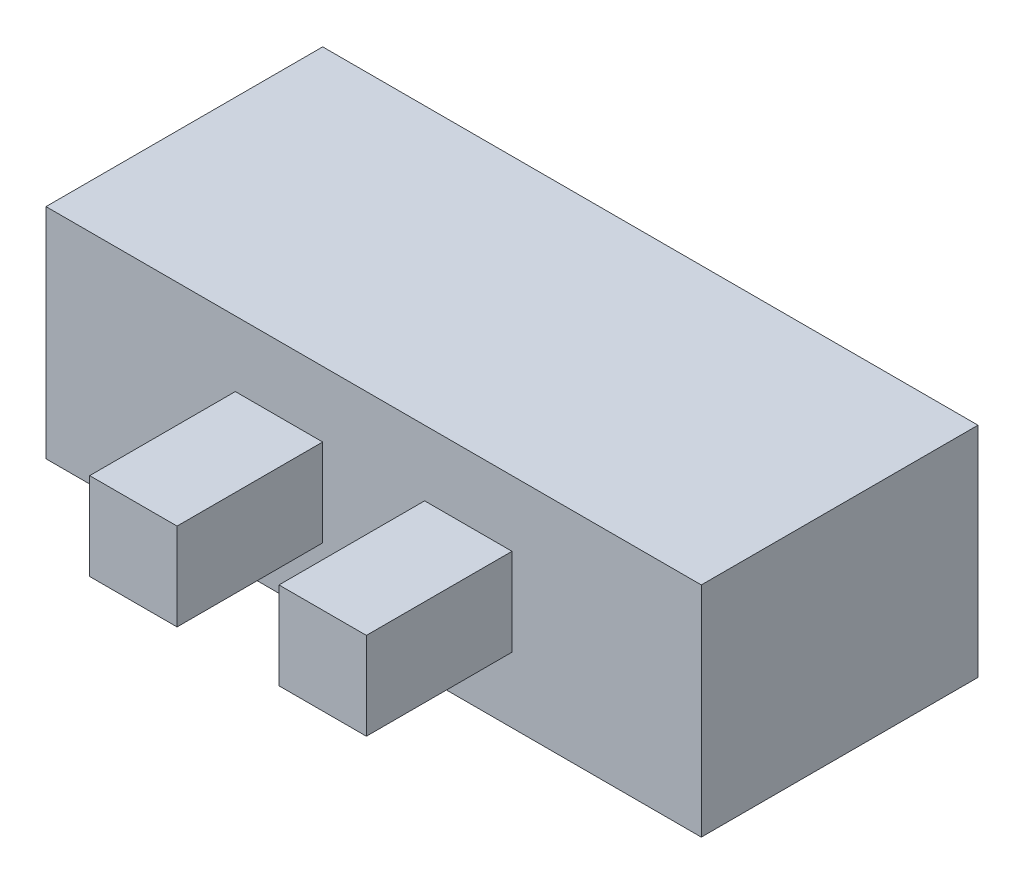
ISO-10303-21;
HEADER;
FILE_DESCRIPTION(('STEP AP214'),'2;1');
FILE_NAME('part.step','',(''),(''),'','','');
FILE_SCHEMA(('AUTOMOTIVE_DESIGN { 1 0 10303 214 1 1 1 1 }'));
ENDSEC;
DATA;
#1=APPLICATION_CONTEXT('core data for automotive mechanical design processes');
#2=APPLICATION_PROTOCOL_DEFINITION('international standard','automotive_design',2000,#1);
#3=PRODUCT_CONTEXT('',#1,'mechanical');
#4=PRODUCT('Part','Part','',(#3));
#5=PRODUCT_RELATED_PRODUCT_CATEGORY('part','',(#4));
#6=PRODUCT_DEFINITION_FORMATION('','',#4);
#7=PRODUCT_DEFINITION_CONTEXT('part definition',#1,'design');
#8=PRODUCT_DEFINITION('design','',#6,#7);
#9=PRODUCT_DEFINITION_SHAPE('','',#8);
#10=(LENGTH_UNIT() NAMED_UNIT(*) SI_UNIT(.MILLI.,.METRE.));
#11=(NAMED_UNIT(*) PLANE_ANGLE_UNIT() SI_UNIT($,.RADIAN.));
#12=(NAMED_UNIT(*) SI_UNIT($,.STERADIAN.) SOLID_ANGLE_UNIT());
#13=UNCERTAINTY_MEASURE_WITH_UNIT(LENGTH_MEASURE(1.E-05),#10,'distance_accuracy_value','');
#14=(GEOMETRIC_REPRESENTATION_CONTEXT(3) GLOBAL_UNCERTAINTY_ASSIGNED_CONTEXT((#13)) GLOBAL_UNIT_ASSIGNED_CONTEXT((#10,
#11,#12)) REPRESENTATION_CONTEXT('',''));
#15=CARTESIAN_POINT('',(0.,0.,0.));
#16=DIRECTION('',(0.,0.,1.));
#17=DIRECTION('',(1.,0.,0.));
#18=AXIS2_PLACEMENT_3D('',#15,#16,#17);
#19=CARTESIAN_POINT('',(0.,0.,3.8));
#20=DIRECTION('',(0.,0.,1.));
#21=DIRECTION('',(1.,0.,0.));
#22=AXIS2_PLACEMENT_3D('',#19,#20,#21);
#23=PLANE('',#22);
#24=DIRECTION('',(0.,-1.,0.));
#25=VECTOR('',#24,1.);
#26=CARTESIAN_POINT('',(0.,0.,3.8));
#27=LINE('',#26,#25);
#28=CARTESIAN_POINT('',(0.,0.,3.8));
#29=VERTEX_POINT('',#28);
#30=CARTESIAN_POINT('',(0.,-3.,3.8));
#31=VERTEX_POINT('',#30);
#32=EDGE_CURVE('E181',#29,#31,#27,.T.);
#33=ORIENTED_EDGE('',*,*,#32,.T.);
#34=DIRECTION('',(1.,0.,0.));
#35=VECTOR('',#34,1.);
#36=CARTESIAN_POINT('',(0.,-3.,3.8));
#37=LINE('',#36,#35);
#38=CARTESIAN_POINT('',(9.,-3.,3.8));
#39=VERTEX_POINT('',#38);
#40=EDGE_CURVE('E184',#31,#39,#37,.T.);
#41=ORIENTED_EDGE('',*,*,#40,.T.);
#42=DIRECTION('',(0.,1.,0.));
#43=VECTOR('',#42,1.);
#44=CARTESIAN_POINT('',(9.,0.,3.8));
#45=LINE('',#44,#43);
#46=CARTESIAN_POINT('',(9.,0.,3.8));
#47=VERTEX_POINT('',#46);
#48=EDGE_CURVE('E187',#39,#47,#45,.T.);
#49=ORIENTED_EDGE('',*,*,#48,.T.);
#50=DIRECTION('',(-1.,0.,0.));
#51=VECTOR('',#50,1.);
#52=CARTESIAN_POINT('',(0.,0.,3.8));
#53=LINE('',#52,#51);
#54=EDGE_CURVE('E189',#47,#29,#53,.T.);
#55=ORIENTED_EDGE('',*,*,#54,.T.);
#56=EDGE_LOOP('',(#33,#41,#49,#55));
#57=FACE_BOUND('',#56,.T.);
#58=DIRECTION('',(1.,0.,0.));
#59=VECTOR('',#58,1.);
#60=CARTESIAN_POINT('',(2.6,-2.1,3.8));
#61=LINE('',#60,#59);
#62=CARTESIAN_POINT('',(2.6,-2.1,3.8));
#63=VERTEX_POINT('',#62);
#64=CARTESIAN_POINT('',(3.8,-2.1,3.8));
#65=VERTEX_POINT('',#64);
#66=EDGE_CURVE('E152',#63,#65,#61,.T.);
#67=ORIENTED_EDGE('',*,*,#66,.F.);
#68=DIRECTION('',(0.,-1.,0.));
#69=VECTOR('',#68,1.);
#70=CARTESIAN_POINT('',(2.6,-2.1,3.8));
#71=LINE('',#70,#69);
#72=CARTESIAN_POINT('',(2.6,-0.9,3.8));
#73=VERTEX_POINT('',#72);
#74=EDGE_CURVE('E149',#73,#63,#71,.T.);
#75=ORIENTED_EDGE('',*,*,#74,.F.);
#76=DIRECTION('',(-1.,0.,0.));
#77=VECTOR('',#76,1.);
#78=CARTESIAN_POINT('',(2.6,-0.9,3.8));
#79=LINE('',#78,#77);
#80=CARTESIAN_POINT('',(3.8,-0.9,3.8));
#81=VERTEX_POINT('',#80);
#82=EDGE_CURVE('E161',#81,#73,#79,.T.);
#83=ORIENTED_EDGE('',*,*,#82,.F.);
#84=DIRECTION('',(0.,1.,0.));
#85=VECTOR('',#84,1.);
#86=CARTESIAN_POINT('',(3.8,-2.1,3.8));
#87=LINE('',#86,#85);
#88=EDGE_CURVE('E169',#65,#81,#87,.T.);
#89=ORIENTED_EDGE('',*,*,#88,.F.);
#90=EDGE_LOOP('',(#67,#75,#83,#89));
#91=FACE_BOUND('',#90,.T.);
#92=DIRECTION('',(1.,0.,0.));
#93=VECTOR('',#92,1.);
#94=CARTESIAN_POINT('',(5.2,-2.1,3.8));
#95=LINE('',#94,#93);
#96=CARTESIAN_POINT('',(5.2,-2.1,3.8));
#97=VERTEX_POINT('',#96);
#98=CARTESIAN_POINT('',(6.4,-2.1,3.8));
#99=VERTEX_POINT('',#98);
#100=EDGE_CURVE('E372',#97,#99,#95,.T.);
#101=ORIENTED_EDGE('',*,*,#100,.F.);
#102=DIRECTION('',(0.,-1.,0.));
#103=VECTOR('',#102,1.);
#104=CARTESIAN_POINT('',(5.2,-2.1,3.8));
#105=LINE('',#104,#103);
#106=CARTESIAN_POINT('',(5.2,-0.9,3.8));
#107=VERTEX_POINT('',#106);
#108=EDGE_CURVE('E147',#107,#97,#105,.T.);
#109=ORIENTED_EDGE('',*,*,#108,.F.);
#110=DIRECTION('',(-1.,0.,0.));
#111=VECTOR('',#110,1.);
#112=CARTESIAN_POINT('',(5.2,-0.9,3.8));
#113=LINE('',#112,#111);
#114=CARTESIAN_POINT('',(6.4,-0.9,3.8));
#115=VERTEX_POINT('',#114);
#116=EDGE_CURVE('E143',#115,#107,#113,.T.);
#117=ORIENTED_EDGE('',*,*,#116,.F.);
#118=DIRECTION('',(0.,1.,0.));
#119=VECTOR('',#118,1.);
#120=CARTESIAN_POINT('',(6.4,-2.1,3.8));
#121=LINE('',#120,#119);
#122=EDGE_CURVE('E369',#99,#115,#121,.T.);
#123=ORIENTED_EDGE('',*,*,#122,.F.);
#124=EDGE_LOOP('',(#101,#109,#117,#123));
#125=FACE_BOUND('',#124,.T.);
#126=ADVANCED_FACE('F34',(#57,#91,#125),#23,.T.);
#127=CARTESIAN_POINT('',(0.,0.,3.8));
#128=DIRECTION('',(1.,0.,0.));
#129=DIRECTION('',(0.,1.,0.));
#130=AXIS2_PLACEMENT_3D('',#127,#128,#129);
#131=PLANE('',#130);
#132=DIRECTION('',(0.,-1.,0.));
#133=VECTOR('',#132,1.);
#134=CARTESIAN_POINT('',(0.,0.,0.));
#135=LINE('',#134,#133);
#136=CARTESIAN_POINT('',(0.,0.,0.));
#137=VERTEX_POINT('',#136);
#138=CARTESIAN_POINT('',(0.,-3.,0.));
#139=VERTEX_POINT('',#138);
#140=EDGE_CURVE('E180',#137,#139,#135,.T.);
#141=ORIENTED_EDGE('',*,*,#140,.T.);
#142=DIRECTION('',(0.,0.,-1.));
#143=VECTOR('',#142,1.);
#144=CARTESIAN_POINT('',(0.,-3.,3.8));
#145=LINE('',#144,#143);
#146=EDGE_CURVE('E11',#31,#139,#145,.T.);
#147=ORIENTED_EDGE('',*,*,#146,.F.);
#148=ORIENTED_EDGE('',*,*,#32,.F.);
#149=DIRECTION('',(0.,0.,-1.));
#150=VECTOR('',#149,1.);
#151=CARTESIAN_POINT('',(0.,0.,3.8));
#152=LINE('',#151,#150);
#153=EDGE_CURVE('E191',#29,#137,#152,.T.);
#154=ORIENTED_EDGE('',*,*,#153,.T.);
#155=EDGE_LOOP('',(#141,#147,#148,#154));
#156=FACE_BOUND('',#155,.T.);
#157=ADVANCED_FACE('F36',(#156),#131,.F.);
#158=CARTESIAN_POINT('',(0.,-3.,3.8));
#159=DIRECTION('',(0.,1.,0.));
#160=DIRECTION('',(0.,0.,1.));
#161=AXIS2_PLACEMENT_3D('',#158,#159,#160);
#162=PLANE('',#161);
#163=DIRECTION('',(1.,0.,0.));
#164=VECTOR('',#163,1.);
#165=CARTESIAN_POINT('',(0.,-3.,0.));
#166=LINE('',#165,#164);
#167=CARTESIAN_POINT('',(9.,-3.,0.));
#168=VERTEX_POINT('',#167);
#169=EDGE_CURVE('E194',#139,#168,#166,.T.);
#170=ORIENTED_EDGE('',*,*,#169,.T.);
#171=DIRECTION('',(0.,0.,-1.));
#172=VECTOR('',#171,1.);
#173=CARTESIAN_POINT('',(9.,-3.,3.8));
#174=LINE('',#173,#172);
#175=EDGE_CURVE('E42',#39,#168,#174,.T.);
#176=ORIENTED_EDGE('',*,*,#175,.F.);
#177=ORIENTED_EDGE('',*,*,#40,.F.);
#178=ORIENTED_EDGE('',*,*,#146,.T.);
#179=EDGE_LOOP('',(#170,#176,#177,#178));
#180=FACE_BOUND('',#179,.T.);
#181=ADVANCED_FACE('F224',(#180),#162,.F.);
#182=CARTESIAN_POINT('',(9.,0.,3.8));
#183=DIRECTION('',(-1.,0.,0.));
#184=DIRECTION('',(0.,-1.,0.));
#185=AXIS2_PLACEMENT_3D('',#182,#183,#184);
#186=PLANE('',#185);
#187=DIRECTION('',(0.,1.,0.));
#188=VECTOR('',#187,1.);
#189=CARTESIAN_POINT('',(9.,0.,0.));
#190=LINE('',#189,#188);
#191=CARTESIAN_POINT('',(9.,0.,0.));
#192=VERTEX_POINT('',#191);
#193=EDGE_CURVE('E196',#168,#192,#190,.T.);
#194=ORIENTED_EDGE('',*,*,#193,.T.);
#195=DIRECTION('',(0.,0.,-1.));
#196=VECTOR('',#195,1.);
#197=CARTESIAN_POINT('',(9.,0.,3.8));
#198=LINE('',#197,#196);
#199=EDGE_CURVE('E201',#47,#192,#198,.T.);
#200=ORIENTED_EDGE('',*,*,#199,.F.);
#201=ORIENTED_EDGE('',*,*,#48,.F.);
#202=ORIENTED_EDGE('',*,*,#175,.T.);
#203=EDGE_LOOP('',(#194,#200,#201,#202));
#204=FACE_BOUND('',#203,.T.);
#205=ADVANCED_FACE('F208',(#204),#186,.F.);
#206=CARTESIAN_POINT('',(0.,0.,3.8));
#207=DIRECTION('',(0.,-1.,0.));
#208=DIRECTION('',(0.,0.,-1.));
#209=AXIS2_PLACEMENT_3D('',#206,#207,#208);
#210=PLANE('',#209);
#211=DIRECTION('',(-1.,0.,0.));
#212=VECTOR('',#211,1.);
#213=CARTESIAN_POINT('',(0.,0.,0.));
#214=LINE('',#213,#212);
#215=EDGE_CURVE('E185',#192,#137,#214,.T.);
#216=ORIENTED_EDGE('',*,*,#215,.T.);
#217=ORIENTED_EDGE('',*,*,#153,.F.);
#218=ORIENTED_EDGE('',*,*,#54,.F.);
#219=ORIENTED_EDGE('',*,*,#199,.T.);
#220=EDGE_LOOP('',(#216,#217,#218,#219));
#221=FACE_BOUND('',#220,.T.);
#222=ADVANCED_FACE('F217',(#221),#210,.F.);
#223=CARTESIAN_POINT('',(0.,0.,0.));
#224=DIRECTION('',(0.,0.,1.));
#225=DIRECTION('',(1.,0.,0.));
#226=AXIS2_PLACEMENT_3D('',#223,#224,#225);
#227=PLANE('',#226);
#228=ORIENTED_EDGE('',*,*,#140,.F.);
#229=ORIENTED_EDGE('',*,*,#215,.F.);
#230=ORIENTED_EDGE('',*,*,#193,.F.);
#231=ORIENTED_EDGE('',*,*,#169,.F.);
#232=EDGE_LOOP('',(#228,#229,#230,#231));
#233=FACE_BOUND('',#232,.T.);
#234=ADVANCED_FACE('F214',(#233),#227,.F.);
#235=CARTESIAN_POINT('',(2.6,-2.1,5.8));
#236=DIRECTION('',(1.,0.,0.));
#237=DIRECTION('',(0.,0.,-1.));
#238=AXIS2_PLACEMENT_3D('',#235,#236,#237);
#239=PLANE('',#238);
#240=ORIENTED_EDGE('',*,*,#74,.T.);
#241=DIRECTION('',(0.,0.,-1.));
#242=VECTOR('',#241,1.);
#243=CARTESIAN_POINT('',(2.6,-2.1,5.8));
#244=LINE('',#243,#242);
#245=CARTESIAN_POINT('',(2.6,-2.1,5.8));
#246=VERTEX_POINT('',#245);
#247=EDGE_CURVE('E178',#246,#63,#244,.T.);
#248=ORIENTED_EDGE('',*,*,#247,.F.);
#249=DIRECTION('',(0.,-1.,0.));
#250=VECTOR('',#249,1.);
#251=CARTESIAN_POINT('',(2.6,-2.1,5.8));
#252=LINE('',#251,#250);
#253=CARTESIAN_POINT('',(2.6,-0.9,5.8));
#254=VERTEX_POINT('',#253);
#255=EDGE_CURVE('E157',#254,#246,#252,.T.);
#256=ORIENTED_EDGE('',*,*,#255,.F.);
#257=DIRECTION('',(0.,0.,-1.));
#258=VECTOR('',#257,1.);
#259=CARTESIAN_POINT('',(2.6,-0.9,5.8));
#260=LINE('',#259,#258);
#261=EDGE_CURVE('E166',#254,#73,#260,.T.);
#262=ORIENTED_EDGE('',*,*,#261,.T.);
#263=EDGE_LOOP('',(#240,#248,#256,#262));
#264=FACE_BOUND('',#263,.T.);
#265=ADVANCED_FACE('F237',(#264),#239,.F.);
#266=CARTESIAN_POINT('',(2.6,-2.1,5.8));
#267=DIRECTION('',(0.,1.,0.));
#268=DIRECTION('',(0.,0.,1.));
#269=AXIS2_PLACEMENT_3D('',#266,#267,#268);
#270=PLANE('',#269);
#271=ORIENTED_EDGE('',*,*,#66,.T.);
#272=DIRECTION('',(0.,0.,-1.));
#273=VECTOR('',#272,1.);
#274=CARTESIAN_POINT('',(3.8,-2.1,5.8));
#275=LINE('',#274,#273);
#276=CARTESIAN_POINT('',(3.8,-2.1,5.8));
#277=VERTEX_POINT('',#276);
#278=EDGE_CURVE('E175',#277,#65,#275,.T.);
#279=ORIENTED_EDGE('',*,*,#278,.F.);
#280=DIRECTION('',(1.,0.,0.));
#281=VECTOR('',#280,1.);
#282=CARTESIAN_POINT('',(2.6,-2.1,5.8));
#283=LINE('',#282,#281);
#284=EDGE_CURVE('E160',#246,#277,#283,.T.);
#285=ORIENTED_EDGE('',*,*,#284,.F.);
#286=ORIENTED_EDGE('',*,*,#247,.T.);
#287=EDGE_LOOP('',(#271,#279,#285,#286));
#288=FACE_BOUND('',#287,.T.);
#289=ADVANCED_FACE('F257',(#288),#270,.F.);
#290=CARTESIAN_POINT('',(3.8,-2.1,5.8));
#291=DIRECTION('',(-1.,0.,0.));
#292=DIRECTION('',(0.,0.,1.));
#293=AXIS2_PLACEMENT_3D('',#290,#291,#292);
#294=PLANE('',#293);
#295=ORIENTED_EDGE('',*,*,#88,.T.);
#296=DIRECTION('',(0.,0.,-1.));
#297=VECTOR('',#296,1.);
#298=CARTESIAN_POINT('',(3.8,-0.9,5.8));
#299=LINE('',#298,#297);
#300=CARTESIAN_POINT('',(3.8,-0.9,5.8));
#301=VERTEX_POINT('',#300);
#302=EDGE_CURVE('E57',#301,#81,#299,.T.);
#303=ORIENTED_EDGE('',*,*,#302,.F.);
#304=DIRECTION('',(0.,1.,0.));
#305=VECTOR('',#304,1.);
#306=CARTESIAN_POINT('',(3.8,-2.1,5.8));
#307=LINE('',#306,#305);
#308=EDGE_CURVE('E163',#277,#301,#307,.T.);
#309=ORIENTED_EDGE('',*,*,#308,.F.);
#310=ORIENTED_EDGE('',*,*,#278,.T.);
#311=EDGE_LOOP('',(#295,#303,#309,#310));
#312=FACE_BOUND('',#311,.T.);
#313=ADVANCED_FACE('F264',(#312),#294,.F.);
#314=CARTESIAN_POINT('',(2.6,-0.9,5.8));
#315=DIRECTION('',(0.,-1.,0.));
#316=DIRECTION('',(0.,0.,-1.));
#317=AXIS2_PLACEMENT_3D('',#314,#315,#316);
#318=PLANE('',#317);
#319=ORIENTED_EDGE('',*,*,#82,.T.);
#320=ORIENTED_EDGE('',*,*,#261,.F.);
#321=DIRECTION('',(-1.,0.,0.));
#322=VECTOR('',#321,1.);
#323=CARTESIAN_POINT('',(2.6,-0.9,5.8));
#324=LINE('',#323,#322);
#325=EDGE_CURVE('E165',#301,#254,#324,.T.);
#326=ORIENTED_EDGE('',*,*,#325,.F.);
#327=ORIENTED_EDGE('',*,*,#302,.T.);
#328=EDGE_LOOP('',(#319,#320,#326,#327));
#329=FACE_BOUND('',#328,.T.);
#330=ADVANCED_FACE('F271',(#329),#318,.F.);
#331=CARTESIAN_POINT('',(0.,0.,5.8));
#332=DIRECTION('',(0.,0.,-1.));
#333=DIRECTION('',(-1.,0.,0.));
#334=AXIS2_PLACEMENT_3D('',#331,#332,#333);
#335=PLANE('',#334);
#336=ORIENTED_EDGE('',*,*,#255,.T.);
#337=ORIENTED_EDGE('',*,*,#284,.T.);
#338=ORIENTED_EDGE('',*,*,#308,.T.);
#339=ORIENTED_EDGE('',*,*,#325,.T.);
#340=EDGE_LOOP('',(#336,#337,#338,#339));
#341=FACE_BOUND('',#340,.T.);
#342=ADVANCED_FACE('F279',(#341),#335,.F.);
#343=CARTESIAN_POINT('',(5.2,-2.1,5.8));
#344=DIRECTION('',(1.,0.,0.));
#345=DIRECTION('',(0.,0.,-1.));
#346=AXIS2_PLACEMENT_3D('',#343,#344,#345);
#347=PLANE('',#346);
#348=ORIENTED_EDGE('',*,*,#108,.T.);
#349=DIRECTION('',(0.,0.,-1.));
#350=VECTOR('',#349,1.);
#351=CARTESIAN_POINT('',(5.2,-2.1,5.8));
#352=LINE('',#351,#350);
#353=CARTESIAN_POINT('',(5.2,-2.1,5.8));
#354=VERTEX_POINT('',#353);
#355=EDGE_CURVE('E128',#354,#97,#352,.T.);
#356=ORIENTED_EDGE('',*,*,#355,.F.);
#357=DIRECTION('',(0.,-1.,0.));
#358=VECTOR('',#357,1.);
#359=CARTESIAN_POINT('',(5.2,-2.1,5.8));
#360=LINE('',#359,#358);
#361=CARTESIAN_POINT('',(5.2,-0.9,5.8));
#362=VERTEX_POINT('',#361);
#363=EDGE_CURVE('E135',#362,#354,#360,.T.);
#364=ORIENTED_EDGE('',*,*,#363,.F.);
#365=DIRECTION('',(0.,0.,-1.));
#366=VECTOR('',#365,1.);
#367=CARTESIAN_POINT('',(5.2,-0.9,5.8));
#368=LINE('',#367,#366);
#369=EDGE_CURVE('E366',#362,#107,#368,.T.);
#370=ORIENTED_EDGE('',*,*,#369,.T.);
#371=EDGE_LOOP('',(#348,#356,#364,#370));
#372=FACE_BOUND('',#371,.T.);
#373=ADVANCED_FACE('F145',(#372),#347,.F.);
#374=CARTESIAN_POINT('',(5.2,-2.1,5.8));
#375=DIRECTION('',(0.,1.,0.));
#376=DIRECTION('',(0.,0.,1.));
#377=AXIS2_PLACEMENT_3D('',#374,#375,#376);
#378=PLANE('',#377);
#379=ORIENTED_EDGE('',*,*,#100,.T.);
#380=DIRECTION('',(0.,0.,-1.));
#381=VECTOR('',#380,1.);
#382=CARTESIAN_POINT('',(6.4,-2.1,5.8));
#383=LINE('',#382,#381);
#384=CARTESIAN_POINT('',(6.4,-2.1,5.8));
#385=VERTEX_POINT('',#384);
#386=EDGE_CURVE('E131',#385,#99,#383,.T.);
#387=ORIENTED_EDGE('',*,*,#386,.F.);
#388=DIRECTION('',(1.,0.,0.));
#389=VECTOR('',#388,1.);
#390=CARTESIAN_POINT('',(5.2,-2.1,5.8));
#391=LINE('',#390,#389);
#392=EDGE_CURVE('E124',#354,#385,#391,.T.);
#393=ORIENTED_EDGE('',*,*,#392,.F.);
#394=ORIENTED_EDGE('',*,*,#355,.T.);
#395=EDGE_LOOP('',(#379,#387,#393,#394));
#396=FACE_BOUND('',#395,.T.);
#397=ADVANCED_FACE('F126',(#396),#378,.F.);
#398=CARTESIAN_POINT('',(6.4,-2.1,5.8));
#399=DIRECTION('',(-1.,0.,0.));
#400=DIRECTION('',(0.,0.,1.));
#401=AXIS2_PLACEMENT_3D('',#398,#399,#400);
#402=PLANE('',#401);
#403=ORIENTED_EDGE('',*,*,#122,.T.);
#404=DIRECTION('',(0.,0.,-1.));
#405=VECTOR('',#404,1.);
#406=CARTESIAN_POINT('',(6.4,-0.9,5.8));
#407=LINE('',#406,#405);
#408=CARTESIAN_POINT('',(6.4,-0.9,5.8));
#409=VERTEX_POINT('',#408);
#410=EDGE_CURVE('E49',#409,#115,#407,.T.);
#411=ORIENTED_EDGE('',*,*,#410,.F.);
#412=DIRECTION('',(0.,1.,0.));
#413=VECTOR('',#412,1.);
#414=CARTESIAN_POINT('',(6.4,-2.1,5.8));
#415=LINE('',#414,#413);
#416=EDGE_CURVE('E134',#385,#409,#415,.T.);
#417=ORIENTED_EDGE('',*,*,#416,.F.);
#418=ORIENTED_EDGE('',*,*,#386,.T.);
#419=EDGE_LOOP('',(#403,#411,#417,#418));
#420=FACE_BOUND('',#419,.T.);
#421=ADVANCED_FACE('F299',(#420),#402,.F.);
#422=CARTESIAN_POINT('',(5.2,-0.9,5.8));
#423=DIRECTION('',(0.,-1.,0.));
#424=DIRECTION('',(1.,0.,0.));
#425=AXIS2_PLACEMENT_3D('',#422,#423,#424);
#426=PLANE('',#425);
#427=ORIENTED_EDGE('',*,*,#116,.T.);
#428=ORIENTED_EDGE('',*,*,#369,.F.);
#429=DIRECTION('',(-1.,0.,0.));
#430=VECTOR('',#429,1.);
#431=CARTESIAN_POINT('',(5.2,-0.9,5.8));
#432=LINE('',#431,#430);
#433=EDGE_CURVE('E139',#409,#362,#432,.T.);
#434=ORIENTED_EDGE('',*,*,#433,.F.);
#435=ORIENTED_EDGE('',*,*,#410,.T.);
#436=EDGE_LOOP('',(#427,#428,#434,#435));
#437=FACE_BOUND('',#436,.T.);
#438=ADVANCED_FACE('F306',(#437),#426,.F.);
#439=CARTESIAN_POINT('',(0.,0.,5.8));
#440=DIRECTION('',(0.,0.,-1.));
#441=DIRECTION('',(-1.,0.,0.));
#442=AXIS2_PLACEMENT_3D('',#439,#440,#441);
#443=PLANE('',#442);
#444=ORIENTED_EDGE('',*,*,#363,.T.);
#445=ORIENTED_EDGE('',*,*,#392,.T.);
#446=ORIENTED_EDGE('',*,*,#416,.T.);
#447=ORIENTED_EDGE('',*,*,#433,.T.);
#448=EDGE_LOOP('',(#444,#445,#446,#447));
#449=FACE_BOUND('',#448,.T.);
#450=ADVANCED_FACE('F138',(#449),#443,.F.);
#451=CLOSED_SHELL('',(#126,#157,#181,#205,#222,#234,#265,#289,#313,#330,#342,#373,#397,#421,
#438,#450));
#452=MANIFOLD_SOLID_BREP('B2',#451);
#453=ADVANCED_BREP_SHAPE_REPRESENTATION('',(#18,#452),#14);
#454=SHAPE_DEFINITION_REPRESENTATION(#9,#453);
ENDSEC;
END-ISO-10303-21;
